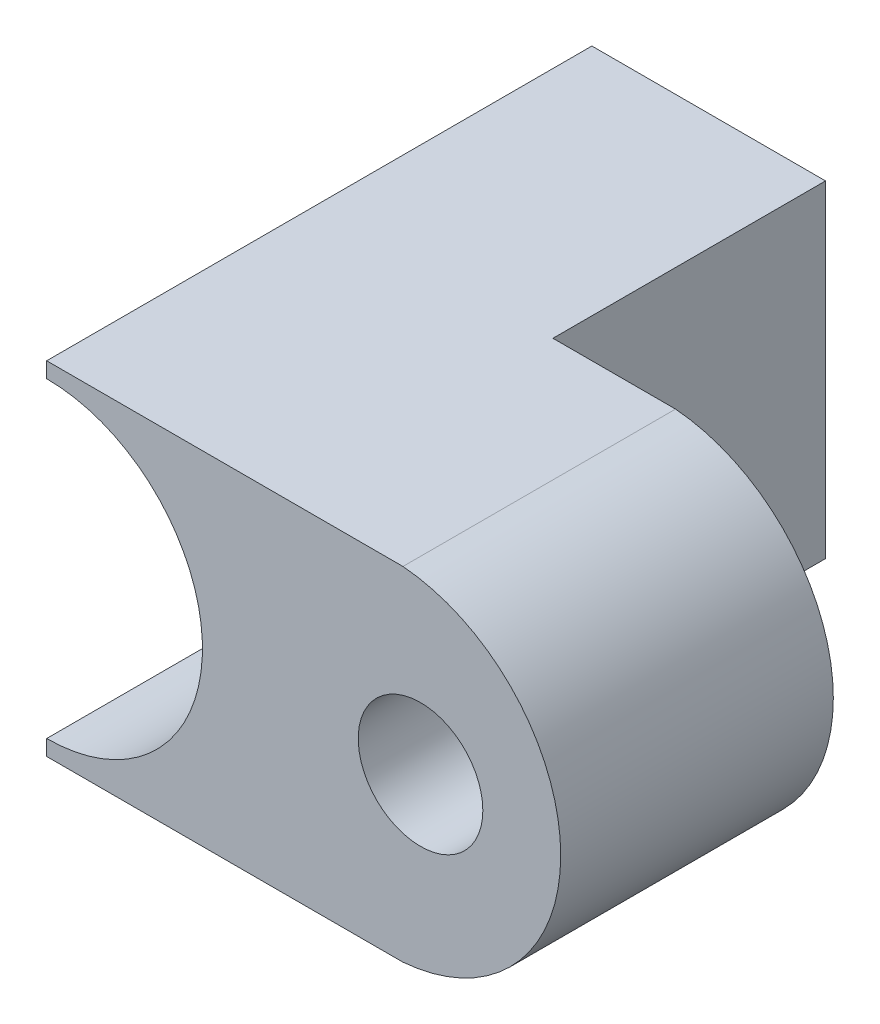
ISO-10303-21;
HEADER;
FILE_DESCRIPTION(('STEP AP214'),'2;1');
FILE_NAME('part.step','',(''),(''),'','','');
FILE_SCHEMA(('AUTOMOTIVE_DESIGN { 1 0 10303 214 1 1 1 1 }'));
ENDSEC;
DATA;
#1=APPLICATION_CONTEXT('core data for automotive mechanical design processes');
#2=APPLICATION_PROTOCOL_DEFINITION('international standard','automotive_design',2000,#1);
#3=PRODUCT_CONTEXT('',#1,'mechanical');
#4=PRODUCT('Part','Part','',(#3));
#5=PRODUCT_RELATED_PRODUCT_CATEGORY('part','',(#4));
#6=PRODUCT_DEFINITION_FORMATION('','',#4);
#7=PRODUCT_DEFINITION_CONTEXT('part definition',#1,'design');
#8=PRODUCT_DEFINITION('design','',#6,#7);
#9=PRODUCT_DEFINITION_SHAPE('','',#8);
#10=(LENGTH_UNIT() NAMED_UNIT(*) SI_UNIT(.MILLI.,.METRE.));
#11=(NAMED_UNIT(*) PLANE_ANGLE_UNIT() SI_UNIT($,.RADIAN.));
#12=(NAMED_UNIT(*) SI_UNIT($,.STERADIAN.) SOLID_ANGLE_UNIT());
#13=UNCERTAINTY_MEASURE_WITH_UNIT(LENGTH_MEASURE(1.E-05),#10,'distance_accuracy_value','');
#14=(GEOMETRIC_REPRESENTATION_CONTEXT(3) GLOBAL_UNCERTAINTY_ASSIGNED_CONTEXT((#13)) GLOBAL_UNIT_ASSIGNED_CONTEXT((#10,
#11,#12)) REPRESENTATION_CONTEXT('',''));
#15=CARTESIAN_POINT('',(0.,0.,0.));
#16=DIRECTION('',(0.,0.,1.));
#17=DIRECTION('',(1.,0.,0.));
#18=AXIS2_PLACEMENT_3D('',#15,#16,#17);
#19=CARTESIAN_POINT('',(27.8923885019855,12.7,44.45));
#20=DIRECTION('',(0.,0.,-1.));
#21=DIRECTION('',(-1.,0.,0.));
#22=AXIS2_PLACEMENT_3D('',#19,#20,#21);
#23=CYLINDRICAL_SURFACE('',#22,14.0176114980145);
#24=CARTESIAN_POINT('',(27.8923885019855,12.7,22.225));
#25=DIRECTION('',(0.,0.,-1.));
#26=DIRECTION('',(-1.,0.,0.));
#27=AXIS2_PLACEMENT_3D('',#24,#25,#26);
#28=CIRCLE('',#27,14.0176114980145);
#29=CARTESIAN_POINT('',(29.0467420480314,26.67,22.225));
#30=VERTEX_POINT('',#29);
#31=CARTESIAN_POINT('',(29.0467420480314,-1.27,22.225));
#32=VERTEX_POINT('',#31);
#33=EDGE_CURVE('E141',#30,#32,#28,.T.);
#34=ORIENTED_EDGE('',*,*,#33,.F.);
#35=DIRECTION('',(0.,0.,-1.));
#36=VECTOR('',#35,1.);
#37=CARTESIAN_POINT('',(29.0467420480314,26.67,44.45));
#38=LINE('',#37,#36);
#39=CARTESIAN_POINT('',(29.0467420480314,26.67,44.45));
#40=VERTEX_POINT('',#39);
#41=EDGE_CURVE('E147',#40,#30,#38,.T.);
#42=ORIENTED_EDGE('',*,*,#41,.F.);
#43=CARTESIAN_POINT('',(27.8923885019855,12.7,44.45));
#44=DIRECTION('',(0.,0.,1.));
#45=DIRECTION('',(1.,0.,0.));
#46=AXIS2_PLACEMENT_3D('',#43,#44,#45);
#47=CIRCLE('',#46,14.0176114980145);
#48=CARTESIAN_POINT('',(29.0467420480314,-1.27,44.45));
#49=VERTEX_POINT('',#48);
#50=EDGE_CURVE('E172',#49,#40,#47,.T.);
#51=ORIENTED_EDGE('',*,*,#50,.F.);
#52=DIRECTION('',(0.,0.,-1.));
#53=VECTOR('',#52,1.);
#54=CARTESIAN_POINT('',(29.0467420480314,-1.27,44.45));
#55=LINE('',#54,#53);
#56=EDGE_CURVE('E198',#49,#32,#55,.T.);
#57=ORIENTED_EDGE('',*,*,#56,.T.);
#58=EDGE_LOOP('',(#34,#42,#51,#57));
#59=FACE_BOUND('',#58,.T.);
#60=ADVANCED_FACE('F50',(#59),#23,.T.);
#61=CARTESIAN_POINT('',(0.,25.4,44.45));
#62=DIRECTION('',(1.,0.,0.));
#63=DIRECTION('',(0.,1.,0.));
#64=AXIS2_PLACEMENT_3D('',#61,#62,#63);
#65=PLANE('',#64);
#66=DIRECTION('',(0.,-1.,0.));
#67=VECTOR('',#66,1.);
#68=CARTESIAN_POINT('',(0.,25.4,0.));
#69=LINE('',#68,#67);
#70=CARTESIAN_POINT('',(0.,26.67,0.));
#71=VERTEX_POINT('',#70);
#72=CARTESIAN_POINT('',(0.,25.4,0.));
#73=VERTEX_POINT('',#72);
#74=EDGE_CURVE('E140',#71,#73,#69,.T.);
#75=ORIENTED_EDGE('',*,*,#74,.T.);
#76=DIRECTION('',(0.,0.,-1.));
#77=VECTOR('',#76,1.);
#78=CARTESIAN_POINT('',(0.,25.4,44.45));
#79=LINE('',#78,#77);
#80=CARTESIAN_POINT('',(0.,25.4,44.45));
#81=VERTEX_POINT('',#80);
#82=EDGE_CURVE('E210',#81,#73,#79,.T.);
#83=ORIENTED_EDGE('',*,*,#82,.F.);
#84=DIRECTION('',(0.,-1.,0.));
#85=VECTOR('',#84,1.);
#86=CARTESIAN_POINT('',(0.,25.4,44.45));
#87=LINE('',#86,#85);
#88=CARTESIAN_POINT('',(0.,26.67,44.45));
#89=VERTEX_POINT('',#88);
#90=EDGE_CURVE('E158',#89,#81,#87,.T.);
#91=ORIENTED_EDGE('',*,*,#90,.F.);
#92=DIRECTION('',(0.,0.,-1.));
#93=VECTOR('',#92,1.);
#94=CARTESIAN_POINT('',(0.,26.67,44.45));
#95=LINE('',#94,#93);
#96=EDGE_CURVE('E178',#89,#71,#95,.T.);
#97=ORIENTED_EDGE('',*,*,#96,.T.);
#98=EDGE_LOOP('',(#75,#83,#91,#97));
#99=FACE_BOUND('',#98,.T.);
#100=ADVANCED_FACE('F234',(#99),#65,.F.);
#101=CARTESIAN_POINT('',(0.,12.7,44.45));
#102=DIRECTION('',(0.,0.,-1.));
#103=DIRECTION('',(-1.,0.,0.));
#104=AXIS2_PLACEMENT_3D('',#101,#102,#103);
#105=CYLINDRICAL_SURFACE('',#104,12.7);
#106=CARTESIAN_POINT('',(0.,12.7,0.));
#107=DIRECTION('',(0.,0.,-1.));
#108=DIRECTION('',(1.,0.,0.));
#109=AXIS2_PLACEMENT_3D('',#106,#107,#108);
#110=CIRCLE('',#109,12.7);
#111=CARTESIAN_POINT('',(0.,0.,0.));
#112=VERTEX_POINT('',#111);
#113=EDGE_CURVE('E182',#73,#112,#110,.T.);
#114=ORIENTED_EDGE('',*,*,#113,.T.);
#115=DIRECTION('',(0.,0.,-1.));
#116=VECTOR('',#115,1.);
#117=CARTESIAN_POINT('',(0.,0.,44.45));
#118=LINE('',#117,#116);
#119=CARTESIAN_POINT('',(0.,0.,44.45));
#120=VERTEX_POINT('',#119);
#121=EDGE_CURVE('E206',#120,#112,#118,.T.);
#122=ORIENTED_EDGE('',*,*,#121,.F.);
#123=CARTESIAN_POINT('',(0.,12.7,44.45));
#124=DIRECTION('',(0.,0.,-1.));
#125=DIRECTION('',(1.,0.,0.));
#126=AXIS2_PLACEMENT_3D('',#123,#124,#125);
#127=CIRCLE('',#126,12.7);
#128=EDGE_CURVE('E162',#81,#120,#127,.T.);
#129=ORIENTED_EDGE('',*,*,#128,.F.);
#130=ORIENTED_EDGE('',*,*,#82,.T.);
#131=EDGE_LOOP('',(#114,#122,#129,#130));
#132=FACE_BOUND('',#131,.T.);
#133=ADVANCED_FACE('F248',(#132),#105,.F.);
#134=CARTESIAN_POINT('',(0.,0.,44.45));
#135=DIRECTION('',(1.,0.,0.));
#136=DIRECTION('',(0.,0.,-1.));
#137=AXIS2_PLACEMENT_3D('',#134,#135,#136);
#138=PLANE('',#137);
#139=DIRECTION('',(0.,-1.,0.));
#140=VECTOR('',#139,1.);
#141=CARTESIAN_POINT('',(0.,0.,0.));
#142=LINE('',#141,#140);
#143=CARTESIAN_POINT('',(0.,-1.27,0.));
#144=VERTEX_POINT('',#143);
#145=EDGE_CURVE('E185',#112,#144,#142,.T.);
#146=ORIENTED_EDGE('',*,*,#145,.T.);
#147=DIRECTION('',(0.,0.,-1.));
#148=VECTOR('',#147,1.);
#149=CARTESIAN_POINT('',(0.,-1.27,44.45));
#150=LINE('',#149,#148);
#151=CARTESIAN_POINT('',(0.,-1.27,44.45));
#152=VERTEX_POINT('',#151);
#153=EDGE_CURVE('E202',#152,#144,#150,.T.);
#154=ORIENTED_EDGE('',*,*,#153,.F.);
#155=DIRECTION('',(0.,-1.,0.));
#156=VECTOR('',#155,1.);
#157=CARTESIAN_POINT('',(0.,0.,44.45));
#158=LINE('',#157,#156);
#159=EDGE_CURVE('E166',#120,#152,#158,.T.);
#160=ORIENTED_EDGE('',*,*,#159,.F.);
#161=ORIENTED_EDGE('',*,*,#121,.T.);
#162=EDGE_LOOP('',(#146,#154,#160,#161));
#163=FACE_BOUND('',#162,.T.);
#164=ADVANCED_FACE('F246',(#163),#138,.F.);
#165=CARTESIAN_POINT('',(0.,-1.27,44.45));
#166=DIRECTION('',(0.,1.,0.));
#167=DIRECTION('',(0.,0.,1.));
#168=AXIS2_PLACEMENT_3D('',#165,#166,#167);
#169=PLANE('',#168);
#170=DIRECTION('',(1.,0.,0.));
#171=VECTOR('',#170,1.);
#172=CARTESIAN_POINT('',(0.,-1.27,0.));
#173=LINE('',#172,#171);
#174=CARTESIAN_POINT('',(17.78,-1.27,0.));
#175=VERTEX_POINT('',#174);
#176=EDGE_CURVE('E188',#144,#175,#173,.T.);
#177=ORIENTED_EDGE('',*,*,#176,.T.);
#178=DIRECTION('',(0.,0.,1.));
#179=VECTOR('',#178,1.);
#180=CARTESIAN_POINT('',(17.78,-1.27,44.45));
#181=LINE('',#180,#179);
#182=CARTESIAN_POINT('',(17.78,-1.27,22.225));
#183=VERTEX_POINT('',#182);
#184=EDGE_CURVE('E60',#175,#183,#181,.T.);
#185=ORIENTED_EDGE('',*,*,#184,.T.);
#186=DIRECTION('',(-1.,0.,0.));
#187=VECTOR('',#186,1.);
#188=CARTESIAN_POINT('',(19.05,-1.27,22.225));
#189=LINE('',#188,#187);
#190=EDGE_CURVE('E66',#32,#183,#189,.T.);
#191=ORIENTED_EDGE('',*,*,#190,.F.);
#192=ORIENTED_EDGE('',*,*,#56,.F.);
#193=DIRECTION('',(1.,0.,0.));
#194=VECTOR('',#193,1.);
#195=CARTESIAN_POINT('',(0.,-1.27,44.45));
#196=LINE('',#195,#194);
#197=EDGE_CURVE('E169',#152,#49,#196,.T.);
#198=ORIENTED_EDGE('',*,*,#197,.F.);
#199=ORIENTED_EDGE('',*,*,#153,.T.);
#200=EDGE_LOOP('',(#177,#185,#191,#192,#198,#199));
#201=FACE_BOUND('',#200,.T.);
#202=ADVANCED_FACE('F226',(#201),#169,.F.);
#203=CARTESIAN_POINT('',(0.,26.67,44.45));
#204=DIRECTION('',(0.,-1.,0.));
#205=DIRECTION('',(1.,0.,0.));
#206=AXIS2_PLACEMENT_3D('',#203,#204,#205);
#207=PLANE('',#206);
#208=DIRECTION('',(1.,0.,0.));
#209=VECTOR('',#208,1.);
#210=CARTESIAN_POINT('',(29.0467420480314,26.67,22.225));
#211=LINE('',#210,#209);
#212=CARTESIAN_POINT('',(19.05,26.67,22.225));
#213=VERTEX_POINT('',#212);
#214=EDGE_CURVE('E125',#213,#30,#211,.T.);
#215=ORIENTED_EDGE('',*,*,#214,.F.);
#216=DIRECTION('',(0.,0.,-1.));
#217=VECTOR('',#216,1.);
#218=CARTESIAN_POINT('',(19.05,26.67,22.225));
#219=LINE('',#218,#217);
#220=CARTESIAN_POINT('',(19.05,26.67,0.));
#221=VERTEX_POINT('',#220);
#222=EDGE_CURVE('E134',#213,#221,#219,.T.);
#223=ORIENTED_EDGE('',*,*,#222,.T.);
#224=DIRECTION('',(-1.,0.,0.));
#225=VECTOR('',#224,1.);
#226=CARTESIAN_POINT('',(0.,26.67,0.));
#227=LINE('',#226,#225);
#228=EDGE_CURVE('E163',#221,#71,#227,.T.);
#229=ORIENTED_EDGE('',*,*,#228,.T.);
#230=ORIENTED_EDGE('',*,*,#96,.F.);
#231=DIRECTION('',(-1.,0.,0.));
#232=VECTOR('',#231,1.);
#233=CARTESIAN_POINT('',(0.,26.67,44.45));
#234=LINE('',#233,#232);
#235=EDGE_CURVE('E175',#40,#89,#234,.T.);
#236=ORIENTED_EDGE('',*,*,#235,.F.);
#237=ORIENTED_EDGE('',*,*,#41,.T.);
#238=EDGE_LOOP('',(#215,#223,#229,#230,#236,#237));
#239=FACE_BOUND('',#238,.T.);
#240=ADVANCED_FACE('F144',(#239),#207,.F.);
#241=CARTESIAN_POINT('',(27.8923885019855,12.7,44.45));
#242=DIRECTION('',(0.,0.,1.));
#243=DIRECTION('',(1.,0.,0.));
#244=AXIS2_PLACEMENT_3D('',#241,#242,#243);
#245=PLANE('',#244);
#246=CARTESIAN_POINT('',(30.48,12.7,44.45));
#247=DIRECTION('',(0.,0.,1.));
#248=DIRECTION('',(1.,0.,0.));
#249=AXIS2_PLACEMENT_3D('',#246,#247,#248);
#250=CIRCLE('',#249,5.08);
#251=CARTESIAN_POINT('',(35.56,12.7,44.45));
#252=VERTEX_POINT('',#251);
#253=EDGE_CURVE('E218',#252,#252,#250,.T.);
#254=ORIENTED_EDGE('',*,*,#253,.F.);
#255=EDGE_LOOP('',(#254));
#256=FACE_BOUND('',#255,.T.);
#257=ORIENTED_EDGE('',*,*,#90,.T.);
#258=ORIENTED_EDGE('',*,*,#128,.T.);
#259=ORIENTED_EDGE('',*,*,#159,.T.);
#260=ORIENTED_EDGE('',*,*,#197,.T.);
#261=ORIENTED_EDGE('',*,*,#50,.T.);
#262=ORIENTED_EDGE('',*,*,#235,.T.);
#263=EDGE_LOOP('',(#257,#258,#259,#260,#261,#262));
#264=FACE_BOUND('',#263,.T.);
#265=ADVANCED_FACE('F237',(#256,#264),#245,.T.);
#266=CARTESIAN_POINT('',(27.8923885019855,12.7,0.));
#267=DIRECTION('',(0.,0.,1.));
#268=DIRECTION('',(1.,0.,0.));
#269=AXIS2_PLACEMENT_3D('',#266,#267,#268);
#270=PLANE('',#269);
#271=DIRECTION('',(0.,1.,0.));
#272=VECTOR('',#271,1.);
#273=CARTESIAN_POINT('',(19.05,-1.27,0.));
#274=LINE('',#273,#272);
#275=CARTESIAN_POINT('',(19.05,0.,0.));
#276=VERTEX_POINT('',#275);
#277=EDGE_CURVE('E136',#276,#221,#274,.T.);
#278=ORIENTED_EDGE('',*,*,#277,.F.);
#279=DIRECTION('',(0.707106781186551,0.707106781186544,0.));
#280=VECTOR('',#279,1.);
#281=CARTESIAN_POINT('',(19.05,0.,0.));
#282=LINE('',#281,#280);
#283=EDGE_CURVE('E74',#276,#175,#282,.F.);
#284=ORIENTED_EDGE('',*,*,#283,.T.);
#285=ORIENTED_EDGE('',*,*,#176,.F.);
#286=ORIENTED_EDGE('',*,*,#145,.F.);
#287=ORIENTED_EDGE('',*,*,#113,.F.);
#288=ORIENTED_EDGE('',*,*,#74,.F.);
#289=ORIENTED_EDGE('',*,*,#228,.F.);
#290=EDGE_LOOP('',(#278,#284,#285,#286,#287,#288,#289));
#291=FACE_BOUND('',#290,.T.);
#292=ADVANCED_FACE('F229',(#291),#270,.F.);
#293=CARTESIAN_POINT('',(19.05,-1.27,22.225));
#294=DIRECTION('',(-1.,0.,0.));
#295=DIRECTION('',(0.,0.,1.));
#296=AXIS2_PLACEMENT_3D('',#293,#294,#295);
#297=PLANE('',#296);
#298=DIRECTION('',(0.,1.,0.));
#299=VECTOR('',#298,1.);
#300=CARTESIAN_POINT('',(19.05,-1.27,22.225));
#301=LINE('',#300,#299);
#302=CARTESIAN_POINT('',(19.05,0.,22.225));
#303=VERTEX_POINT('',#302);
#304=EDGE_CURVE('E121',#303,#213,#301,.T.);
#305=ORIENTED_EDGE('',*,*,#304,.F.);
#306=DIRECTION('',(0.,0.,-1.));
#307=VECTOR('',#306,1.);
#308=CARTESIAN_POINT('',(19.05,0.,22.225));
#309=LINE('',#308,#307);
#310=EDGE_CURVE('E214',#303,#276,#309,.T.);
#311=ORIENTED_EDGE('',*,*,#310,.T.);
#312=ORIENTED_EDGE('',*,*,#277,.T.);
#313=ORIENTED_EDGE('',*,*,#222,.F.);
#314=EDGE_LOOP('',(#305,#311,#312,#313));
#315=FACE_BOUND('',#314,.T.);
#316=ADVANCED_FACE('F135',(#315),#297,.F.);
#317=CARTESIAN_POINT('',(27.8923885019855,12.7,22.225));
#318=DIRECTION('',(0.,0.,-1.));
#319=DIRECTION('',(-1.,0.,0.));
#320=AXIS2_PLACEMENT_3D('',#317,#318,#319);
#321=PLANE('',#320);
#322=CARTESIAN_POINT('',(30.48,12.7,22.225));
#323=DIRECTION('',(0.,0.,-1.));
#324=DIRECTION('',(-1.,0.,0.));
#325=AXIS2_PLACEMENT_3D('',#322,#323,#324);
#326=CIRCLE('',#325,5.07999999999999);
#327=CARTESIAN_POINT('',(25.4,12.7,22.225));
#328=VERTEX_POINT('',#327);
#329=EDGE_CURVE('E156',#328,#328,#326,.T.);
#330=ORIENTED_EDGE('',*,*,#329,.F.);
#331=EDGE_LOOP('',(#330));
#332=FACE_BOUND('',#331,.T.);
#333=ORIENTED_EDGE('',*,*,#190,.T.);
#334=DIRECTION('',(-0.707106781186551,-0.707106781186544,0.));
#335=VECTOR('',#334,1.);
#336=CARTESIAN_POINT('',(19.05,0.,22.225));
#337=LINE('',#336,#335);
#338=EDGE_CURVE('E12',#183,#303,#337,.F.);
#339=ORIENTED_EDGE('',*,*,#338,.T.);
#340=ORIENTED_EDGE('',*,*,#304,.T.);
#341=ORIENTED_EDGE('',*,*,#214,.T.);
#342=ORIENTED_EDGE('',*,*,#33,.T.);
#343=EDGE_LOOP('',(#333,#339,#340,#341,#342));
#344=FACE_BOUND('',#343,.T.);
#345=ADVANCED_FACE('F123',(#332,#344),#321,.T.);
#346=CARTESIAN_POINT('',(30.48,12.7,44.45));
#347=DIRECTION('',(0.,0.,1.));
#348=DIRECTION('',(1.,0.,0.));
#349=AXIS2_PLACEMENT_3D('',#346,#347,#348);
#350=CYLINDRICAL_SURFACE('',#349,5.07999999999999);
#351=ORIENTED_EDGE('',*,*,#329,.T.);
#352=EDGE_LOOP('',(#351));
#353=FACE_BOUND('',#352,.T.);
#354=ORIENTED_EDGE('',*,*,#253,.T.);
#355=EDGE_LOOP('',(#354));
#356=FACE_BOUND('',#355,.T.);
#357=ADVANCED_FACE('F282',(#353,#356),#350,.F.);
#358=CARTESIAN_POINT('',(19.05,0.,22.225));
#359=DIRECTION('',(-0.707106781186544,0.707106781186551,0.));
#360=DIRECTION('',(0.,0.,-1.));
#361=AXIS2_PLACEMENT_3D('',#358,#359,#360);
#362=PLANE('',#361);
#363=ORIENTED_EDGE('',*,*,#338,.F.);
#364=ORIENTED_EDGE('',*,*,#184,.F.);
#365=ORIENTED_EDGE('',*,*,#283,.F.);
#366=ORIENTED_EDGE('',*,*,#310,.F.);
#367=EDGE_LOOP('',(#363,#364,#365,#366));
#368=FACE_BOUND('',#367,.T.);
#369=ADVANCED_FACE('F53',(#368),#362,.F.);
#370=CLOSED_SHELL('',(#60,#100,#133,#164,#202,#240,#265,#292,#316,#345,#357,#369));
#371=MANIFOLD_SOLID_BREP('B2',#370);
#372=ADVANCED_BREP_SHAPE_REPRESENTATION('',(#18,#371),#14);
#373=SHAPE_DEFINITION_REPRESENTATION(#9,#372);
ENDSEC;
END-ISO-10303-21;
